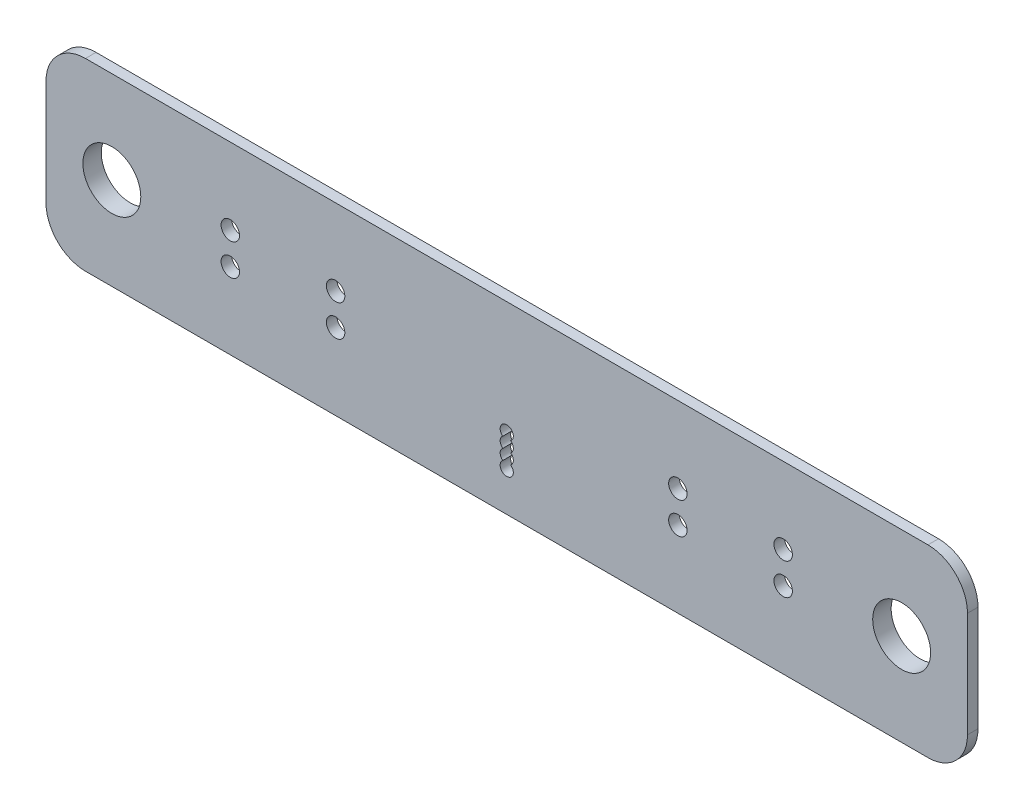
ISO-10303-21;
HEADER;
FILE_DESCRIPTION(('STEP AP214'),'2;1');
FILE_NAME('part.step','',(''),(''),'','','');
FILE_SCHEMA(('AUTOMOTIVE_DESIGN { 1 0 10303 214 1 1 1 1 }'));
ENDSEC;
DATA;
#1=APPLICATION_CONTEXT('core data for automotive mechanical design processes');
#2=APPLICATION_PROTOCOL_DEFINITION('international standard','automotive_design',2000,#1);
#3=PRODUCT_CONTEXT('',#1,'mechanical');
#4=PRODUCT('Part','Part','',(#3));
#5=PRODUCT_RELATED_PRODUCT_CATEGORY('part','',(#4));
#6=PRODUCT_DEFINITION_FORMATION('','',#4);
#7=PRODUCT_DEFINITION_CONTEXT('part definition',#1,'design');
#8=PRODUCT_DEFINITION('design','',#6,#7);
#9=PRODUCT_DEFINITION_SHAPE('','',#8);
#10=(LENGTH_UNIT() NAMED_UNIT(*) SI_UNIT(.MILLI.,.METRE.));
#11=(NAMED_UNIT(*) PLANE_ANGLE_UNIT() SI_UNIT($,.RADIAN.));
#12=(NAMED_UNIT(*) SI_UNIT($,.STERADIAN.) SOLID_ANGLE_UNIT());
#13=UNCERTAINTY_MEASURE_WITH_UNIT(LENGTH_MEASURE(1.E-05),#10,'distance_accuracy_value','');
#14=(GEOMETRIC_REPRESENTATION_CONTEXT(3) GLOBAL_UNCERTAINTY_ASSIGNED_CONTEXT((#13)) GLOBAL_UNIT_ASSIGNED_CONTEXT((#10,
#11,#12)) REPRESENTATION_CONTEXT('',''));
#15=CARTESIAN_POINT('',(0.,0.,0.));
#16=DIRECTION('',(0.,0.,1.));
#17=DIRECTION('',(1.,0.,0.));
#18=AXIS2_PLACEMENT_3D('',#15,#16,#17);
#19=CARTESIAN_POINT('',(0.,0.,0.));
#20=DIRECTION('',(0.,0.,1.));
#21=DIRECTION('',(1.,0.,0.));
#22=AXIS2_PLACEMENT_3D('',#19,#20,#21);
#23=PLANE('',#22);
#24=CARTESIAN_POINT('',(65.,6.,0.));
#25=DIRECTION('',(0.,0.,1.));
#26=DIRECTION('',(1.,0.,0.));
#27=AXIS2_PLACEMENT_3D('',#24,#25,#26);
#28=CIRCLE('',#27,3.50000000000001);
#29=CARTESIAN_POINT('',(68.5,6.,0.));
#30=VERTEX_POINT('',#29);
#31=EDGE_CURVE('E215',#30,#30,#28,.T.);
#32=ORIENTED_EDGE('',*,*,#31,.T.);
#33=EDGE_LOOP('',(#32));
#34=FACE_BOUND('',#33,.T.);
#35=CARTESIAN_POINT('',(65.,-6.,0.));
#36=DIRECTION('',(0.,0.,1.));
#37=DIRECTION('',(1.,0.,0.));
#38=AXIS2_PLACEMENT_3D('',#35,#36,#37);
#39=CIRCLE('',#38,3.50000000000001);
#40=CARTESIAN_POINT('',(68.5,-6.,0.));
#41=VERTEX_POINT('',#40);
#42=EDGE_CURVE('E212',#41,#41,#39,.T.);
#43=ORIENTED_EDGE('',*,*,#42,.T.);
#44=EDGE_LOOP('',(#43));
#45=FACE_BOUND('',#44,.T.);
#46=CARTESIAN_POINT('',(105.,-6.,0.));
#47=DIRECTION('',(0.,0.,1.));
#48=DIRECTION('',(1.,0.,0.));
#49=AXIS2_PLACEMENT_3D('',#46,#47,#48);
#50=CIRCLE('',#49,3.50000000000001);
#51=CARTESIAN_POINT('',(108.5,-6.,0.));
#52=VERTEX_POINT('',#51);
#53=EDGE_CURVE('E209',#52,#52,#50,.T.);
#54=ORIENTED_EDGE('',*,*,#53,.T.);
#55=EDGE_LOOP('',(#54));
#56=FACE_BOUND('',#55,.T.);
#57=CARTESIAN_POINT('',(105.,6.,0.));
#58=DIRECTION('',(0.,0.,1.));
#59=DIRECTION('',(1.,0.,0.));
#60=AXIS2_PLACEMENT_3D('',#57,#58,#59);
#61=CIRCLE('',#60,3.50000000000001);
#62=CARTESIAN_POINT('',(108.5,6.,0.));
#63=VERTEX_POINT('',#62);
#64=EDGE_CURVE('E206',#63,#63,#61,.T.);
#65=ORIENTED_EDGE('',*,*,#64,.T.);
#66=EDGE_LOOP('',(#65));
#67=FACE_BOUND('',#66,.T.);
#68=CARTESIAN_POINT('',(-65.,6.,0.));
#69=DIRECTION('',(0.,0.,1.));
#70=DIRECTION('',(1.,0.,0.));
#71=AXIS2_PLACEMENT_3D('',#68,#69,#70);
#72=CIRCLE('',#71,3.50000000000001);
#73=CARTESIAN_POINT('',(-61.5,6.,0.));
#74=VERTEX_POINT('',#73);
#75=EDGE_CURVE('E203',#74,#74,#72,.T.);
#76=ORIENTED_EDGE('',*,*,#75,.T.);
#77=EDGE_LOOP('',(#76));
#78=FACE_BOUND('',#77,.T.);
#79=CARTESIAN_POINT('',(-65.,-6.,0.));
#80=DIRECTION('',(0.,0.,1.));
#81=DIRECTION('',(1.,0.,0.));
#82=AXIS2_PLACEMENT_3D('',#79,#80,#81);
#83=CIRCLE('',#82,3.50000000000001);
#84=CARTESIAN_POINT('',(-61.5,-6.,0.));
#85=VERTEX_POINT('',#84);
#86=EDGE_CURVE('E200',#85,#85,#83,.T.);
#87=ORIENTED_EDGE('',*,*,#86,.T.);
#88=EDGE_LOOP('',(#87));
#89=FACE_BOUND('',#88,.T.);
#90=CARTESIAN_POINT('',(-105.,-6.,0.));
#91=DIRECTION('',(0.,0.,1.));
#92=DIRECTION('',(1.,0.,0.));
#93=AXIS2_PLACEMENT_3D('',#90,#91,#92);
#94=CIRCLE('',#93,3.50000000000001);
#95=CARTESIAN_POINT('',(-101.5,-6.,0.));
#96=VERTEX_POINT('',#95);
#97=EDGE_CURVE('E197',#96,#96,#94,.T.);
#98=ORIENTED_EDGE('',*,*,#97,.T.);
#99=EDGE_LOOP('',(#98));
#100=FACE_BOUND('',#99,.T.);
#101=CARTESIAN_POINT('',(0.,-12.,0.));
#102=DIRECTION('',(0.,0.,1.));
#103=DIRECTION('',(1.,0.,0.));
#104=AXIS2_PLACEMENT_3D('',#101,#102,#103);
#105=CIRCLE('',#104,2.5);
#106=CARTESIAN_POINT('',(-1.49999999999989,-9.99999999999998,0.));
#107=VERTEX_POINT('',#106);
#108=CARTESIAN_POINT('',(-1.49999999999994,-14.,0.));
#109=VERTEX_POINT('',#108);
#110=EDGE_CURVE('E191',#107,#109,#105,.T.);
#111=ORIENTED_EDGE('',*,*,#110,.T.);
#112=CARTESIAN_POINT('',(0.,-16.,0.));
#113=DIRECTION('',(0.,0.,1.));
#114=DIRECTION('',(1.,0.,0.));
#115=AXIS2_PLACEMENT_3D('',#112,#113,#114);
#116=CIRCLE('',#115,2.5);
#117=CARTESIAN_POINT('',(-1.49999999999998,-18.,0.));
#118=VERTEX_POINT('',#117);
#119=EDGE_CURVE('E194',#109,#118,#116,.T.);
#120=ORIENTED_EDGE('',*,*,#119,.T.);
#121=CARTESIAN_POINT('',(0.,-20.,0.));
#122=DIRECTION('',(0.,0.,1.));
#123=DIRECTION('',(1.,0.,0.));
#124=AXIS2_PLACEMENT_3D('',#121,#122,#123);
#125=CIRCLE('',#124,2.5);
#126=CARTESIAN_POINT('',(1.50000000000002,-18.,0.));
#127=VERTEX_POINT('',#126);
#128=EDGE_CURVE('E181',#118,#127,#125,.T.);
#129=ORIENTED_EDGE('',*,*,#128,.T.);
#130=CARTESIAN_POINT('',(0.,-16.,0.));
#131=DIRECTION('',(0.,0.,1.));
#132=DIRECTION('',(1.,0.,0.));
#133=AXIS2_PLACEMENT_3D('',#130,#131,#132);
#134=CIRCLE('',#133,2.5);
#135=CARTESIAN_POINT('',(1.50000000000006,-14.,0.));
#136=VERTEX_POINT('',#135);
#137=EDGE_CURVE('E143',#127,#136,#134,.T.);
#138=ORIENTED_EDGE('',*,*,#137,.T.);
#139=CARTESIAN_POINT('',(0.,-12.,0.));
#140=DIRECTION('',(0.,0.,1.));
#141=DIRECTION('',(1.,0.,0.));
#142=AXIS2_PLACEMENT_3D('',#139,#140,#141);
#143=CIRCLE('',#142,2.5);
#144=CARTESIAN_POINT('',(1.50000000000011,-10.,0.));
#145=VERTEX_POINT('',#144);
#146=EDGE_CURVE('E185',#136,#145,#143,.T.);
#147=ORIENTED_EDGE('',*,*,#146,.T.);
#148=CARTESIAN_POINT('',(1.26305651597926E-13,-8.,0.));
#149=DIRECTION('',(0.,0.,1.));
#150=DIRECTION('',(1.,0.,0.));
#151=AXIS2_PLACEMENT_3D('',#148,#149,#150);
#152=CIRCLE('',#151,2.5);
#153=EDGE_CURVE('E188',#145,#107,#152,.T.);
#154=ORIENTED_EDGE('',*,*,#153,.T.);
#155=EDGE_LOOP('',(#111,#120,#129,#138,#147,#154));
#156=FACE_BOUND('',#155,.T.);
#157=CARTESIAN_POINT('',(-105.,6.,0.));
#158=DIRECTION('',(0.,0.,1.));
#159=DIRECTION('',(1.,0.,0.));
#160=AXIS2_PLACEMENT_3D('',#157,#158,#159);
#161=CIRCLE('',#160,3.50000000000001);
#162=CARTESIAN_POINT('',(-101.5,6.,0.));
#163=VERTEX_POINT('',#162);
#164=EDGE_CURVE('E221',#163,#163,#161,.T.);
#165=ORIENTED_EDGE('',*,*,#164,.T.);
#166=EDGE_LOOP('',(#165));
#167=FACE_BOUND('',#166,.T.);
#168=CARTESIAN_POINT('',(-150.,0.,0.));
#169=DIRECTION('',(0.,0.,1.));
#170=DIRECTION('',(1.,0.,0.));
#171=AXIS2_PLACEMENT_3D('',#168,#169,#170);
#172=CIRCLE('',#171,13.5);
#173=CARTESIAN_POINT('',(-136.5,0.,0.));
#174=VERTEX_POINT('',#173);
#175=EDGE_CURVE('E227',#174,#174,#172,.T.);
#176=ORIENTED_EDGE('',*,*,#175,.T.);
#177=EDGE_LOOP('',(#176));
#178=FACE_BOUND('',#177,.T.);
#179=DIRECTION('',(0.,1.,0.));
#180=VECTOR('',#179,1.);
#181=CARTESIAN_POINT('',(175.,35.,0.));
#182=LINE('',#181,#180);
#183=CARTESIAN_POINT('',(175.,-20.,0.));
#184=VERTEX_POINT('',#183);
#185=CARTESIAN_POINT('',(175.,20.,0.));
#186=VERTEX_POINT('',#185);
#187=EDGE_CURVE('E242',#184,#186,#182,.T.);
#188=ORIENTED_EDGE('',*,*,#187,.F.);
#189=CARTESIAN_POINT('',(160.,-20.,0.));
#190=DIRECTION('',(0.,0.,1.));
#191=DIRECTION('',(1.,0.,0.));
#192=AXIS2_PLACEMENT_3D('',#189,#190,#191);
#193=CIRCLE('',#192,15.);
#194=CARTESIAN_POINT('',(160.,-35.,0.));
#195=VERTEX_POINT('',#194);
#196=EDGE_CURVE('E277',#184,#195,#193,.F.);
#197=ORIENTED_EDGE('',*,*,#196,.T.);
#198=DIRECTION('',(1.,0.,0.));
#199=VECTOR('',#198,1.);
#200=CARTESIAN_POINT('',(-175.,-35.,0.));
#201=LINE('',#200,#199);
#202=CARTESIAN_POINT('',(-160.,-35.,0.));
#203=VERTEX_POINT('',#202);
#204=EDGE_CURVE('E247',#203,#195,#201,.T.);
#205=ORIENTED_EDGE('',*,*,#204,.F.);
#206=CARTESIAN_POINT('',(-160.,-20.,0.));
#207=DIRECTION('',(0.,0.,1.));
#208=DIRECTION('',(1.,0.,0.));
#209=AXIS2_PLACEMENT_3D('',#206,#207,#208);
#210=CIRCLE('',#209,15.);
#211=CARTESIAN_POINT('',(-175.,-20.,0.));
#212=VERTEX_POINT('',#211);
#213=EDGE_CURVE('E273',#203,#212,#210,.F.);
#214=ORIENTED_EDGE('',*,*,#213,.T.);
#215=DIRECTION('',(0.,-1.,0.));
#216=VECTOR('',#215,1.);
#217=CARTESIAN_POINT('',(-175.,35.,0.));
#218=LINE('',#217,#216);
#219=CARTESIAN_POINT('',(-175.,20.,0.));
#220=VERTEX_POINT('',#219);
#221=EDGE_CURVE('E262',#220,#212,#218,.T.);
#222=ORIENTED_EDGE('',*,*,#221,.F.);
#223=CARTESIAN_POINT('',(-160.,20.,0.));
#224=DIRECTION('',(0.,0.,1.));
#225=DIRECTION('',(1.,0.,0.));
#226=AXIS2_PLACEMENT_3D('',#223,#224,#225);
#227=CIRCLE('',#226,15.);
#228=CARTESIAN_POINT('',(-160.,35.,0.));
#229=VERTEX_POINT('',#228);
#230=EDGE_CURVE('E271',#220,#229,#227,.F.);
#231=ORIENTED_EDGE('',*,*,#230,.T.);
#232=DIRECTION('',(-1.,0.,0.));
#233=VECTOR('',#232,1.);
#234=CARTESIAN_POINT('',(-175.,35.,0.));
#235=LINE('',#234,#233);
#236=CARTESIAN_POINT('',(160.,35.,0.));
#237=VERTEX_POINT('',#236);
#238=EDGE_CURVE('E259',#237,#229,#235,.T.);
#239=ORIENTED_EDGE('',*,*,#238,.F.);
#240=CARTESIAN_POINT('',(160.,20.,0.));
#241=DIRECTION('',(0.,0.,1.));
#242=DIRECTION('',(1.,0.,0.));
#243=AXIS2_PLACEMENT_3D('',#240,#241,#242);
#244=CIRCLE('',#243,15.);
#245=EDGE_CURVE('E275',#237,#186,#244,.F.);
#246=ORIENTED_EDGE('',*,*,#245,.T.);
#247=EDGE_LOOP('',(#188,#197,#205,#214,#222,#231,#239,#246));
#248=FACE_BOUND('',#247,.T.);
#249=CARTESIAN_POINT('',(150.,0.,0.));
#250=DIRECTION('',(0.,0.,1.));
#251=DIRECTION('',(1.,0.,0.));
#252=AXIS2_PLACEMENT_3D('',#249,#250,#251);
#253=CIRCLE('',#252,13.5);
#254=CARTESIAN_POINT('',(163.5,0.,0.));
#255=VERTEX_POINT('',#254);
#256=EDGE_CURVE('E11',#255,#255,#253,.F.);
#257=ORIENTED_EDGE('',*,*,#256,.F.);
#258=EDGE_LOOP('',(#257));
#259=FACE_BOUND('',#258,.T.);
#260=ADVANCED_FACE('F35',(#34,#45,#56,#67,#78,#89,#100,#156,#167,#178,#248,#259),#23,.F.);
#261=CARTESIAN_POINT('',(175.,35.,4.));
#262=DIRECTION('',(-1.,0.,0.));
#263=DIRECTION('',(0.,-1.,0.));
#264=AXIS2_PLACEMENT_3D('',#261,#262,#263);
#265=PLANE('',#264);
#266=DIRECTION('',(0.,1.,0.));
#267=VECTOR('',#266,1.);
#268=CARTESIAN_POINT('',(175.,35.,4.));
#269=LINE('',#268,#267);
#270=CARTESIAN_POINT('',(175.,-20.,4.));
#271=VERTEX_POINT('',#270);
#272=CARTESIAN_POINT('',(175.,20.,4.));
#273=VERTEX_POINT('',#272);
#274=EDGE_CURVE('E243',#271,#273,#269,.T.);
#275=ORIENTED_EDGE('',*,*,#274,.F.);
#276=DIRECTION('',(0.,0.,-1.));
#277=VECTOR('',#276,1.);
#278=CARTESIAN_POINT('',(175.,-20.,4.));
#279=LINE('',#278,#277);
#280=EDGE_CURVE('E268',#271,#184,#279,.T.);
#281=ORIENTED_EDGE('',*,*,#280,.T.);
#282=ORIENTED_EDGE('',*,*,#187,.T.);
#283=DIRECTION('',(0.,0.,-1.));
#284=VECTOR('',#283,1.);
#285=CARTESIAN_POINT('',(175.,20.,4.));
#286=LINE('',#285,#284);
#287=EDGE_CURVE('E256',#186,#273,#286,.F.);
#288=ORIENTED_EDGE('',*,*,#287,.T.);
#289=EDGE_LOOP('',(#275,#281,#282,#288));
#290=FACE_BOUND('',#289,.T.);
#291=ADVANCED_FACE('F326',(#290),#265,.F.);
#292=CARTESIAN_POINT('',(-175.,35.,4.));
#293=DIRECTION('',(0.,-1.,0.));
#294=DIRECTION('',(0.,0.,-1.));
#295=AXIS2_PLACEMENT_3D('',#292,#293,#294);
#296=PLANE('',#295);
#297=DIRECTION('',(-1.,0.,0.));
#298=VECTOR('',#297,1.);
#299=CARTESIAN_POINT('',(-175.,35.,4.));
#300=LINE('',#299,#298);
#301=CARTESIAN_POINT('',(160.,35.,4.));
#302=VERTEX_POINT('',#301);
#303=CARTESIAN_POINT('',(-160.,35.,4.));
#304=VERTEX_POINT('',#303);
#305=EDGE_CURVE('E246',#302,#304,#300,.T.);
#306=ORIENTED_EDGE('',*,*,#305,.F.);
#307=DIRECTION('',(0.,0.,-1.));
#308=VECTOR('',#307,1.);
#309=CARTESIAN_POINT('',(160.,35.,4.));
#310=LINE('',#309,#308);
#311=EDGE_CURVE('E294',#302,#237,#310,.T.);
#312=ORIENTED_EDGE('',*,*,#311,.T.);
#313=ORIENTED_EDGE('',*,*,#238,.T.);
#314=DIRECTION('',(0.,0.,-1.));
#315=VECTOR('',#314,1.);
#316=CARTESIAN_POINT('',(-160.,35.,4.));
#317=LINE('',#316,#315);
#318=EDGE_CURVE('E292',#229,#304,#317,.F.);
#319=ORIENTED_EDGE('',*,*,#318,.T.);
#320=EDGE_LOOP('',(#306,#312,#313,#319));
#321=FACE_BOUND('',#320,.T.);
#322=ADVANCED_FACE('F335',(#321),#296,.F.);
#323=CARTESIAN_POINT('',(-175.,35.,4.));
#324=DIRECTION('',(1.,0.,0.));
#325=DIRECTION('',(0.,0.,-1.));
#326=AXIS2_PLACEMENT_3D('',#323,#324,#325);
#327=PLANE('',#326);
#328=ORIENTED_EDGE('',*,*,#221,.T.);
#329=DIRECTION('',(0.,0.,-1.));
#330=VECTOR('',#329,1.);
#331=CARTESIAN_POINT('',(-175.,-20.,4.));
#332=LINE('',#331,#330);
#333=CARTESIAN_POINT('',(-175.,-20.,4.));
#334=VERTEX_POINT('',#333);
#335=EDGE_CURVE('E44',#212,#334,#332,.F.);
#336=ORIENTED_EDGE('',*,*,#335,.T.);
#337=DIRECTION('',(0.,-1.,0.));
#338=VECTOR('',#337,1.);
#339=CARTESIAN_POINT('',(-175.,35.,4.));
#340=LINE('',#339,#338);
#341=CARTESIAN_POINT('',(-175.,20.,4.));
#342=VERTEX_POINT('',#341);
#343=EDGE_CURVE('E250',#342,#334,#340,.T.);
#344=ORIENTED_EDGE('',*,*,#343,.F.);
#345=DIRECTION('',(0.,0.,-1.));
#346=VECTOR('',#345,1.);
#347=CARTESIAN_POINT('',(-175.,20.,4.));
#348=LINE('',#347,#346);
#349=EDGE_CURVE('E297',#342,#220,#348,.T.);
#350=ORIENTED_EDGE('',*,*,#349,.T.);
#351=EDGE_LOOP('',(#328,#336,#344,#350));
#352=FACE_BOUND('',#351,.T.);
#353=ADVANCED_FACE('F303',(#352),#327,.F.);
#354=CARTESIAN_POINT('',(-175.,-35.,4.));
#355=DIRECTION('',(0.,1.,0.));
#356=DIRECTION('',(0.,0.,1.));
#357=AXIS2_PLACEMENT_3D('',#354,#355,#356);
#358=PLANE('',#357);
#359=ORIENTED_EDGE('',*,*,#204,.T.);
#360=DIRECTION('',(0.,0.,-1.));
#361=VECTOR('',#360,1.);
#362=CARTESIAN_POINT('',(160.,-35.,4.));
#363=LINE('',#362,#361);
#364=CARTESIAN_POINT('',(160.,-35.,4.));
#365=VERTEX_POINT('',#364);
#366=EDGE_CURVE('E282',#195,#365,#363,.F.);
#367=ORIENTED_EDGE('',*,*,#366,.T.);
#368=DIRECTION('',(1.,0.,0.));
#369=VECTOR('',#368,1.);
#370=CARTESIAN_POINT('',(-175.,-35.,4.));
#371=LINE('',#370,#369);
#372=CARTESIAN_POINT('',(-160.,-35.,4.));
#373=VERTEX_POINT('',#372);
#374=EDGE_CURVE('E253',#373,#365,#371,.T.);
#375=ORIENTED_EDGE('',*,*,#374,.F.);
#376=DIRECTION('',(0.,0.,-1.));
#377=VECTOR('',#376,1.);
#378=CARTESIAN_POINT('',(-160.,-35.,4.));
#379=LINE('',#378,#377);
#380=EDGE_CURVE('E279',#373,#203,#379,.T.);
#381=ORIENTED_EDGE('',*,*,#380,.T.);
#382=EDGE_LOOP('',(#359,#367,#375,#381));
#383=FACE_BOUND('',#382,.T.);
#384=ADVANCED_FACE('F315',(#383),#358,.F.);
#385=CARTESIAN_POINT('',(0.,0.,4.));
#386=DIRECTION('',(0.,0.,1.));
#387=DIRECTION('',(1.,0.,0.));
#388=AXIS2_PLACEMENT_3D('',#385,#386,#387);
#389=PLANE('',#388);
#390=CARTESIAN_POINT('',(65.,6.,4.));
#391=DIRECTION('',(0.,0.,1.));
#392=DIRECTION('',(-1.,0.,0.));
#393=AXIS2_PLACEMENT_3D('',#390,#391,#392);
#394=CIRCLE('',#393,3.50000000000001);
#395=CARTESIAN_POINT('',(61.5,6.,4.));
#396=VERTEX_POINT('',#395);
#397=EDGE_CURVE('E183',#396,#396,#394,.T.);
#398=ORIENTED_EDGE('',*,*,#397,.F.);
#399=EDGE_LOOP('',(#398));
#400=FACE_BOUND('',#399,.T.);
#401=CARTESIAN_POINT('',(65.,-6.,4.));
#402=DIRECTION('',(0.,0.,1.));
#403=DIRECTION('',(-1.,0.,0.));
#404=AXIS2_PLACEMENT_3D('',#401,#402,#403);
#405=CIRCLE('',#404,3.50000000000001);
#406=CARTESIAN_POINT('',(61.5,-6.,4.));
#407=VERTEX_POINT('',#406);
#408=EDGE_CURVE('E592',#407,#407,#405,.T.);
#409=ORIENTED_EDGE('',*,*,#408,.F.);
#410=EDGE_LOOP('',(#409));
#411=FACE_BOUND('',#410,.T.);
#412=CARTESIAN_POINT('',(105.,-6.,4.));
#413=DIRECTION('',(0.,0.,1.));
#414=DIRECTION('',(-1.,0.,0.));
#415=AXIS2_PLACEMENT_3D('',#412,#413,#414);
#416=CIRCLE('',#415,3.50000000000001);
#417=CARTESIAN_POINT('',(101.5,-6.,4.));
#418=VERTEX_POINT('',#417);
#419=EDGE_CURVE('E595',#418,#418,#416,.T.);
#420=ORIENTED_EDGE('',*,*,#419,.F.);
#421=EDGE_LOOP('',(#420));
#422=FACE_BOUND('',#421,.T.);
#423=CARTESIAN_POINT('',(105.,6.,4.));
#424=DIRECTION('',(0.,0.,1.));
#425=DIRECTION('',(-1.,0.,0.));
#426=AXIS2_PLACEMENT_3D('',#423,#424,#425);
#427=CIRCLE('',#426,3.50000000000001);
#428=CARTESIAN_POINT('',(101.5,6.,4.));
#429=VERTEX_POINT('',#428);
#430=EDGE_CURVE('E170',#429,#429,#427,.T.);
#431=ORIENTED_EDGE('',*,*,#430,.F.);
#432=EDGE_LOOP('',(#431));
#433=FACE_BOUND('',#432,.T.);
#434=CARTESIAN_POINT('',(-65.,6.,4.));
#435=DIRECTION('',(0.,0.,1.));
#436=DIRECTION('',(1.,0.,0.));
#437=AXIS2_PLACEMENT_3D('',#434,#435,#436);
#438=CIRCLE('',#437,3.50000000000001);
#439=CARTESIAN_POINT('',(-61.5,6.,4.));
#440=VERTEX_POINT('',#439);
#441=EDGE_CURVE('E604',#440,#440,#438,.T.);
#442=ORIENTED_EDGE('',*,*,#441,.F.);
#443=EDGE_LOOP('',(#442));
#444=FACE_BOUND('',#443,.T.);
#445=CARTESIAN_POINT('',(-65.,-6.,4.));
#446=DIRECTION('',(0.,0.,1.));
#447=DIRECTION('',(1.,0.,0.));
#448=AXIS2_PLACEMENT_3D('',#445,#446,#447);
#449=CIRCLE('',#448,3.50000000000001);
#450=CARTESIAN_POINT('',(-61.5,-6.,4.));
#451=VERTEX_POINT('',#450);
#452=EDGE_CURVE('E180',#451,#451,#449,.T.);
#453=ORIENTED_EDGE('',*,*,#452,.F.);
#454=EDGE_LOOP('',(#453));
#455=FACE_BOUND('',#454,.T.);
#456=CARTESIAN_POINT('',(-105.,-6.,4.));
#457=DIRECTION('',(0.,0.,1.));
#458=DIRECTION('',(1.,0.,0.));
#459=AXIS2_PLACEMENT_3D('',#456,#457,#458);
#460=CIRCLE('',#459,3.50000000000001);
#461=CARTESIAN_POINT('',(-101.5,-6.,4.));
#462=VERTEX_POINT('',#461);
#463=EDGE_CURVE('E177',#462,#462,#460,.T.);
#464=ORIENTED_EDGE('',*,*,#463,.F.);
#465=EDGE_LOOP('',(#464));
#466=FACE_BOUND('',#465,.T.);
#467=CARTESIAN_POINT('',(0.,-16.,4.));
#468=DIRECTION('',(0.,0.,1.));
#469=DIRECTION('',(-1.,0.,0.));
#470=AXIS2_PLACEMENT_3D('',#467,#468,#469);
#471=CIRCLE('',#470,2.5);
#472=CARTESIAN_POINT('',(-1.49999999999994,-14.,4.));
#473=VERTEX_POINT('',#472);
#474=CARTESIAN_POINT('',(-1.49999999999998,-18.,4.));
#475=VERTEX_POINT('',#474);
#476=EDGE_CURVE('E59',#473,#475,#471,.T.);
#477=ORIENTED_EDGE('',*,*,#476,.F.);
#478=CARTESIAN_POINT('',(0.,-12.,4.));
#479=DIRECTION('',(0.,0.,1.));
#480=DIRECTION('',(-1.,0.,0.));
#481=AXIS2_PLACEMENT_3D('',#478,#479,#480);
#482=CIRCLE('',#481,2.5);
#483=CARTESIAN_POINT('',(-1.49999999999989,-9.99999999999998,4.));
#484=VERTEX_POINT('',#483);
#485=EDGE_CURVE('E165',#484,#473,#482,.T.);
#486=ORIENTED_EDGE('',*,*,#485,.F.);
#487=CARTESIAN_POINT('',(1.26305651597926E-13,-8.,4.));
#488=DIRECTION('',(0.,0.,1.));
#489=DIRECTION('',(-1.,0.,0.));
#490=AXIS2_PLACEMENT_3D('',#487,#488,#489);
#491=CIRCLE('',#490,2.5);
#492=CARTESIAN_POINT('',(1.50000000000011,-10.,4.));
#493=VERTEX_POINT('',#492);
#494=EDGE_CURVE('E159',#493,#484,#491,.T.);
#495=ORIENTED_EDGE('',*,*,#494,.F.);
#496=CARTESIAN_POINT('',(0.,-12.,4.));
#497=DIRECTION('',(0.,0.,1.));
#498=DIRECTION('',(-1.,0.,0.));
#499=AXIS2_PLACEMENT_3D('',#496,#497,#498);
#500=CIRCLE('',#499,2.5);
#501=CARTESIAN_POINT('',(1.50000000000006,-14.,4.));
#502=VERTEX_POINT('',#501);
#503=EDGE_CURVE('E157',#502,#493,#500,.T.);
#504=ORIENTED_EDGE('',*,*,#503,.F.);
#505=CARTESIAN_POINT('',(0.,-16.,4.));
#506=DIRECTION('',(0.,0.,1.));
#507=DIRECTION('',(-1.,0.,0.));
#508=AXIS2_PLACEMENT_3D('',#505,#506,#507);
#509=CIRCLE('',#508,2.5);
#510=CARTESIAN_POINT('',(1.50000000000002,-18.,4.));
#511=VERTEX_POINT('',#510);
#512=EDGE_CURVE('E140',#511,#502,#509,.T.);
#513=ORIENTED_EDGE('',*,*,#512,.F.);
#514=CARTESIAN_POINT('',(0.,-20.,4.));
#515=DIRECTION('',(0.,0.,1.));
#516=DIRECTION('',(-1.,0.,0.));
#517=AXIS2_PLACEMENT_3D('',#514,#515,#516);
#518=CIRCLE('',#517,2.5);
#519=EDGE_CURVE('E149',#475,#511,#518,.T.);
#520=ORIENTED_EDGE('',*,*,#519,.F.);
#521=EDGE_LOOP('',(#477,#486,#495,#504,#513,#520));
#522=FACE_BOUND('',#521,.T.);
#523=CARTESIAN_POINT('',(-105.,6.,4.));
#524=DIRECTION('',(0.,0.,1.));
#525=DIRECTION('',(1.,0.,0.));
#526=AXIS2_PLACEMENT_3D('',#523,#524,#525);
#527=CIRCLE('',#526,3.50000000000001);
#528=CARTESIAN_POINT('',(-101.5,6.,4.));
#529=VERTEX_POINT('',#528);
#530=EDGE_CURVE('E218',#529,#529,#527,.T.);
#531=ORIENTED_EDGE('',*,*,#530,.F.);
#532=EDGE_LOOP('',(#531));
#533=FACE_BOUND('',#532,.T.);
#534=CARTESIAN_POINT('',(-150.,0.,4.));
#535=DIRECTION('',(0.,0.,1.));
#536=DIRECTION('',(1.,0.,0.));
#537=AXIS2_PLACEMENT_3D('',#534,#535,#536);
#538=CIRCLE('',#537,11.);
#539=CARTESIAN_POINT('',(-139.,0.,4.));
#540=VERTEX_POINT('',#539);
#541=EDGE_CURVE('E39',#540,#540,#538,.F.);
#542=ORIENTED_EDGE('',*,*,#541,.T.);
#543=EDGE_LOOP('',(#542));
#544=FACE_BOUND('',#543,.T.);
#545=CARTESIAN_POINT('',(150.,0.,4.));
#546=DIRECTION('',(0.,0.,1.));
#547=DIRECTION('',(1.,0.,0.));
#548=AXIS2_PLACEMENT_3D('',#545,#546,#547);
#549=CIRCLE('',#548,11.);
#550=CARTESIAN_POINT('',(161.,0.,4.));
#551=VERTEX_POINT('',#550);
#552=EDGE_CURVE('E239',#551,#551,#549,.T.);
#553=ORIENTED_EDGE('',*,*,#552,.F.);
#554=EDGE_LOOP('',(#553));
#555=FACE_BOUND('',#554,.T.);
#556=ORIENTED_EDGE('',*,*,#374,.T.);
#557=CARTESIAN_POINT('',(160.,-20.,4.));
#558=DIRECTION('',(0.,0.,1.));
#559=DIRECTION('',(1.,0.,0.));
#560=AXIS2_PLACEMENT_3D('',#557,#558,#559);
#561=CIRCLE('',#560,15.);
#562=EDGE_CURVE('E290',#365,#271,#561,.T.);
#563=ORIENTED_EDGE('',*,*,#562,.T.);
#564=ORIENTED_EDGE('',*,*,#274,.T.);
#565=CARTESIAN_POINT('',(160.,20.,4.));
#566=DIRECTION('',(0.,0.,1.));
#567=DIRECTION('',(1.,0.,0.));
#568=AXIS2_PLACEMENT_3D('',#565,#566,#567);
#569=CIRCLE('',#568,15.);
#570=EDGE_CURVE('E288',#273,#302,#569,.T.);
#571=ORIENTED_EDGE('',*,*,#570,.T.);
#572=ORIENTED_EDGE('',*,*,#305,.T.);
#573=CARTESIAN_POINT('',(-160.,20.,4.));
#574=DIRECTION('',(0.,0.,1.));
#575=DIRECTION('',(1.,0.,0.));
#576=AXIS2_PLACEMENT_3D('',#573,#574,#575);
#577=CIRCLE('',#576,15.);
#578=EDGE_CURVE('E284',#304,#342,#577,.T.);
#579=ORIENTED_EDGE('',*,*,#578,.T.);
#580=ORIENTED_EDGE('',*,*,#343,.T.);
#581=CARTESIAN_POINT('',(-160.,-20.,4.));
#582=DIRECTION('',(0.,0.,1.));
#583=DIRECTION('',(1.,0.,0.));
#584=AXIS2_PLACEMENT_3D('',#581,#582,#583);
#585=CIRCLE('',#584,15.);
#586=EDGE_CURVE('E286',#334,#373,#585,.T.);
#587=ORIENTED_EDGE('',*,*,#586,.T.);
#588=EDGE_LOOP('',(#556,#563,#564,#571,#572,#579,#580,#587));
#589=FACE_BOUND('',#588,.T.);
#590=ADVANCED_FACE('F153',(#400,#411,#422,#433,#444,#455,#466,#522,#533,#544,#555,#589),#389,.T.);
#591=CARTESIAN_POINT('',(160.,-20.,4.));
#592=DIRECTION('',(0.,0.,-1.));
#593=DIRECTION('',(-1.,0.,0.));
#594=AXIS2_PLACEMENT_3D('',#591,#592,#593);
#595=CYLINDRICAL_SURFACE('',#594,15.);
#596=ORIENTED_EDGE('',*,*,#562,.F.);
#597=ORIENTED_EDGE('',*,*,#366,.F.);
#598=ORIENTED_EDGE('',*,*,#196,.F.);
#599=ORIENTED_EDGE('',*,*,#280,.F.);
#600=EDGE_LOOP('',(#596,#597,#598,#599));
#601=FACE_BOUND('',#600,.T.);
#602=ADVANCED_FACE('F323',(#601),#595,.T.);
#603=CARTESIAN_POINT('',(160.,20.,4.));
#604=DIRECTION('',(0.,0.,-1.));
#605=DIRECTION('',(-1.,0.,0.));
#606=AXIS2_PLACEMENT_3D('',#603,#604,#605);
#607=CYLINDRICAL_SURFACE('',#606,15.);
#608=ORIENTED_EDGE('',*,*,#570,.F.);
#609=ORIENTED_EDGE('',*,*,#287,.F.);
#610=ORIENTED_EDGE('',*,*,#245,.F.);
#611=ORIENTED_EDGE('',*,*,#311,.F.);
#612=EDGE_LOOP('',(#608,#609,#610,#611));
#613=FACE_BOUND('',#612,.T.);
#614=ADVANCED_FACE('F332',(#613),#607,.T.);
#615=CARTESIAN_POINT('',(-160.,-20.,4.));
#616=DIRECTION('',(0.,0.,-1.));
#617=DIRECTION('',(-1.,0.,0.));
#618=AXIS2_PLACEMENT_3D('',#615,#616,#617);
#619=CYLINDRICAL_SURFACE('',#618,15.);
#620=ORIENTED_EDGE('',*,*,#586,.F.);
#621=ORIENTED_EDGE('',*,*,#335,.F.);
#622=ORIENTED_EDGE('',*,*,#213,.F.);
#623=ORIENTED_EDGE('',*,*,#380,.F.);
#624=EDGE_LOOP('',(#620,#621,#622,#623));
#625=FACE_BOUND('',#624,.T.);
#626=ADVANCED_FACE('F312',(#625),#619,.T.);
#627=CARTESIAN_POINT('',(-160.,20.,4.));
#628=DIRECTION('',(0.,0.,-1.));
#629=DIRECTION('',(-1.,0.,0.));
#630=AXIS2_PLACEMENT_3D('',#627,#628,#629);
#631=CYLINDRICAL_SURFACE('',#630,15.);
#632=ORIENTED_EDGE('',*,*,#578,.F.);
#633=ORIENTED_EDGE('',*,*,#318,.F.);
#634=ORIENTED_EDGE('',*,*,#230,.F.);
#635=ORIENTED_EDGE('',*,*,#349,.F.);
#636=EDGE_LOOP('',(#632,#633,#634,#635));
#637=FACE_BOUND('',#636,.T.);
#638=ADVANCED_FACE('F37',(#637),#631,.T.);
#639=CARTESIAN_POINT('',(150.,0.,10.));
#640=DIRECTION('',(0.,0.,-1.));
#641=DIRECTION('',(-1.,0.,0.));
#642=AXIS2_PLACEMENT_3D('',#639,#640,#641);
#643=CYLINDRICAL_SURFACE('',#642,11.);
#644=ORIENTED_EDGE('',*,*,#552,.T.);
#645=EDGE_LOOP('',(#644));
#646=FACE_BOUND('',#645,.T.);
#647=CARTESIAN_POINT('',(150.,0.,-3.));
#648=DIRECTION('',(0.,0.,-1.));
#649=DIRECTION('',(-1.,0.,0.));
#650=AXIS2_PLACEMENT_3D('',#647,#648,#649);
#651=CIRCLE('',#650,11.);
#652=CARTESIAN_POINT('',(139.,0.,-3.));
#653=VERTEX_POINT('',#652);
#654=EDGE_CURVE('E233',#653,#653,#651,.T.);
#655=ORIENTED_EDGE('',*,*,#654,.T.);
#656=EDGE_LOOP('',(#655));
#657=FACE_BOUND('',#656,.T.);
#658=ADVANCED_FACE('F339',(#646,#657),#643,.F.);
#659=CARTESIAN_POINT('',(150.,0.,-3.));
#660=DIRECTION('',(0.,0.,-1.));
#661=DIRECTION('',(-1.,0.,0.));
#662=AXIS2_PLACEMENT_3D('',#659,#660,#661);
#663=PLANE('',#662);
#664=CARTESIAN_POINT('',(150.,0.,-3.));
#665=DIRECTION('',(0.,0.,-1.));
#666=DIRECTION('',(-1.,0.,0.));
#667=AXIS2_PLACEMENT_3D('',#664,#665,#666);
#668=CIRCLE('',#667,13.5);
#669=CARTESIAN_POINT('',(136.5,0.,-3.));
#670=VERTEX_POINT('',#669);
#671=EDGE_CURVE('E236',#670,#670,#668,.T.);
#672=ORIENTED_EDGE('',*,*,#671,.T.);
#673=EDGE_LOOP('',(#672));
#674=FACE_BOUND('',#673,.T.);
#675=ORIENTED_EDGE('',*,*,#654,.F.);
#676=EDGE_LOOP('',(#675));
#677=FACE_BOUND('',#676,.T.);
#678=ADVANCED_FACE('F344',(#674,#677),#663,.T.);
#679=CARTESIAN_POINT('',(150.,0.,-3.));
#680=DIRECTION('',(0.,0.,1.));
#681=DIRECTION('',(1.,0.,0.));
#682=AXIS2_PLACEMENT_3D('',#679,#680,#681);
#683=CYLINDRICAL_SURFACE('',#682,13.5);
#684=ORIENTED_EDGE('',*,*,#671,.F.);
#685=EDGE_LOOP('',(#684));
#686=FACE_BOUND('',#685,.T.);
#687=ORIENTED_EDGE('',*,*,#256,.T.);
#688=EDGE_LOOP('',(#687));
#689=FACE_BOUND('',#688,.T.);
#690=ADVANCED_FACE('F396',(#686,#689),#683,.T.);
#691=CARTESIAN_POINT('',(-150.,0.,10.));
#692=DIRECTION('',(0.,0.,-1.));
#693=DIRECTION('',(-1.,0.,0.));
#694=AXIS2_PLACEMENT_3D('',#691,#692,#693);
#695=CYLINDRICAL_SURFACE('',#694,11.);
#696=ORIENTED_EDGE('',*,*,#541,.F.);
#697=EDGE_LOOP('',(#696));
#698=FACE_BOUND('',#697,.T.);
#699=CARTESIAN_POINT('',(-150.,0.,-3.));
#700=DIRECTION('',(0.,0.,1.));
#701=DIRECTION('',(1.,0.,0.));
#702=AXIS2_PLACEMENT_3D('',#699,#700,#701);
#703=CIRCLE('',#702,11.);
#704=CARTESIAN_POINT('',(-139.,0.,-3.));
#705=VERTEX_POINT('',#704);
#706=EDGE_CURVE('E224',#705,#705,#703,.T.);
#707=ORIENTED_EDGE('',*,*,#706,.F.);
#708=EDGE_LOOP('',(#707));
#709=FACE_BOUND('',#708,.T.);
#710=ADVANCED_FACE('F406',(#698,#709),#695,.F.);
#711=CARTESIAN_POINT('',(-150.,0.,-3.));
#712=DIRECTION('',(0.,0.,1.));
#713=DIRECTION('',(1.,0.,0.));
#714=AXIS2_PLACEMENT_3D('',#711,#712,#713);
#715=CYLINDRICAL_SURFACE('',#714,13.5);
#716=CARTESIAN_POINT('',(-150.,0.,-3.));
#717=DIRECTION('',(0.,0.,1.));
#718=DIRECTION('',(1.,0.,0.));
#719=AXIS2_PLACEMENT_3D('',#716,#717,#718);
#720=CIRCLE('',#719,13.5);
#721=CARTESIAN_POINT('',(-136.5,0.,-3.));
#722=VERTEX_POINT('',#721);
#723=EDGE_CURVE('E228',#722,#722,#720,.T.);
#724=ORIENTED_EDGE('',*,*,#723,.T.);
#725=EDGE_LOOP('',(#724));
#726=FACE_BOUND('',#725,.T.);
#727=ORIENTED_EDGE('',*,*,#175,.F.);
#728=EDGE_LOOP('',(#727));
#729=FACE_BOUND('',#728,.T.);
#730=ADVANCED_FACE('F417',(#726,#729),#715,.T.);
#731=CARTESIAN_POINT('',(-150.,0.,-3.));
#732=DIRECTION('',(0.,0.,-1.));
#733=DIRECTION('',(1.,0.,0.));
#734=AXIS2_PLACEMENT_3D('',#731,#732,#733);
#735=PLANE('',#734);
#736=ORIENTED_EDGE('',*,*,#706,.T.);
#737=EDGE_LOOP('',(#736));
#738=FACE_BOUND('',#737,.T.);
#739=ORIENTED_EDGE('',*,*,#723,.F.);
#740=EDGE_LOOP('',(#739));
#741=FACE_BOUND('',#740,.T.);
#742=ADVANCED_FACE('F427',(#738,#741),#735,.T.);
#743=CARTESIAN_POINT('',(-105.,6.,-6.));
#744=DIRECTION('',(0.,0.,1.));
#745=DIRECTION('',(1.,0.,0.));
#746=AXIS2_PLACEMENT_3D('',#743,#744,#745);
#747=CYLINDRICAL_SURFACE('',#746,3.50000000000001);
#748=ORIENTED_EDGE('',*,*,#530,.T.);
#749=EDGE_LOOP('',(#748));
#750=FACE_BOUND('',#749,.T.);
#751=ORIENTED_EDGE('',*,*,#164,.F.);
#752=EDGE_LOOP('',(#751));
#753=FACE_BOUND('',#752,.T.);
#754=ADVANCED_FACE('F436',(#750,#753),#747,.F.);
#755=CARTESIAN_POINT('',(0.,-16.,-6.));
#756=DIRECTION('',(0.,0.,1.));
#757=DIRECTION('',(1.,0.,0.));
#758=AXIS2_PLACEMENT_3D('',#755,#756,#757);
#759=CYLINDRICAL_SURFACE('',#758,2.5);
#760=DIRECTION('',(0.,0.,1.));
#761=VECTOR('',#760,1.);
#762=CARTESIAN_POINT('',(-1.49999999999994,-14.,-6.));
#763=LINE('',#762,#761);
#764=EDGE_CURVE('E168',#109,#473,#763,.T.);
#765=ORIENTED_EDGE('',*,*,#764,.T.);
#766=ORIENTED_EDGE('',*,*,#476,.T.);
#767=DIRECTION('',(0.,0.,1.));
#768=VECTOR('',#767,1.);
#769=CARTESIAN_POINT('',(-1.49999999999998,-18.,-6.));
#770=LINE('',#769,#768);
#771=EDGE_CURVE('E146',#118,#475,#770,.T.);
#772=ORIENTED_EDGE('',*,*,#771,.F.);
#773=ORIENTED_EDGE('',*,*,#119,.F.);
#774=EDGE_LOOP('',(#765,#766,#772,#773));
#775=FACE_BOUND('',#774,.T.);
#776=ADVANCED_FACE('F459',(#775),#759,.F.);
#777=CARTESIAN_POINT('',(0.,-12.,-6.));
#778=DIRECTION('',(0.,0.,1.));
#779=DIRECTION('',(1.,0.,0.));
#780=AXIS2_PLACEMENT_3D('',#777,#778,#779);
#781=CYLINDRICAL_SURFACE('',#780,2.5);
#782=DIRECTION('',(0.,0.,1.));
#783=VECTOR('',#782,1.);
#784=CARTESIAN_POINT('',(-1.49999999999989,-9.99999999999998,-6.));
#785=LINE('',#784,#783);
#786=EDGE_CURVE('E171',#107,#484,#785,.T.);
#787=ORIENTED_EDGE('',*,*,#786,.T.);
#788=ORIENTED_EDGE('',*,*,#485,.T.);
#789=ORIENTED_EDGE('',*,*,#764,.F.);
#790=ORIENTED_EDGE('',*,*,#110,.F.);
#791=EDGE_LOOP('',(#787,#788,#789,#790));
#792=FACE_BOUND('',#791,.T.);
#793=ADVANCED_FACE('F469',(#792),#781,.F.);
#794=CARTESIAN_POINT('',(1.26305651597926E-13,-8.,-6.));
#795=DIRECTION('',(0.,0.,1.));
#796=DIRECTION('',(1.,0.,0.));
#797=AXIS2_PLACEMENT_3D('',#794,#795,#796);
#798=CYLINDRICAL_SURFACE('',#797,2.5);
#799=DIRECTION('',(0.,0.,1.));
#800=VECTOR('',#799,1.);
#801=CARTESIAN_POINT('',(1.50000000000011,-10.,-6.));
#802=LINE('',#801,#800);
#803=EDGE_CURVE('E173',#145,#493,#802,.T.);
#804=ORIENTED_EDGE('',*,*,#803,.T.);
#805=ORIENTED_EDGE('',*,*,#494,.T.);
#806=ORIENTED_EDGE('',*,*,#786,.F.);
#807=ORIENTED_EDGE('',*,*,#153,.F.);
#808=EDGE_LOOP('',(#804,#805,#806,#807));
#809=FACE_BOUND('',#808,.T.);
#810=ADVANCED_FACE('F478',(#809),#798,.F.);
#811=CARTESIAN_POINT('',(0.,-12.,-6.));
#812=DIRECTION('',(0.,0.,1.));
#813=DIRECTION('',(1.,0.,0.));
#814=AXIS2_PLACEMENT_3D('',#811,#812,#813);
#815=CYLINDRICAL_SURFACE('',#814,2.5);
#816=DIRECTION('',(0.,0.,1.));
#817=VECTOR('',#816,1.);
#818=CARTESIAN_POINT('',(1.50000000000006,-14.,-6.));
#819=LINE('',#818,#817);
#820=EDGE_CURVE('E145',#136,#502,#819,.T.);
#821=ORIENTED_EDGE('',*,*,#820,.T.);
#822=ORIENTED_EDGE('',*,*,#503,.T.);
#823=ORIENTED_EDGE('',*,*,#803,.F.);
#824=ORIENTED_EDGE('',*,*,#146,.F.);
#825=EDGE_LOOP('',(#821,#822,#823,#824));
#826=FACE_BOUND('',#825,.T.);
#827=ADVANCED_FACE('F488',(#826),#815,.F.);
#828=CARTESIAN_POINT('',(0.,-16.,-6.));
#829=DIRECTION('',(0.,0.,1.));
#830=DIRECTION('',(1.,0.,0.));
#831=AXIS2_PLACEMENT_3D('',#828,#829,#830);
#832=CYLINDRICAL_SURFACE('',#831,2.5);
#833=DIRECTION('',(0.,0.,1.));
#834=VECTOR('',#833,1.);
#835=CARTESIAN_POINT('',(1.50000000000002,-18.,-6.));
#836=LINE('',#835,#834);
#837=EDGE_CURVE('E51',#127,#511,#836,.T.);
#838=ORIENTED_EDGE('',*,*,#837,.T.);
#839=ORIENTED_EDGE('',*,*,#512,.T.);
#840=ORIENTED_EDGE('',*,*,#820,.F.);
#841=ORIENTED_EDGE('',*,*,#137,.F.);
#842=EDGE_LOOP('',(#838,#839,#840,#841));
#843=FACE_BOUND('',#842,.T.);
#844=ADVANCED_FACE('F137',(#843),#832,.F.);
#845=CARTESIAN_POINT('',(0.,-20.,-6.));
#846=DIRECTION('',(0.,0.,1.));
#847=DIRECTION('',(1.,0.,0.));
#848=AXIS2_PLACEMENT_3D('',#845,#846,#847);
#849=CYLINDRICAL_SURFACE('',#848,2.5);
#850=ORIENTED_EDGE('',*,*,#771,.T.);
#851=ORIENTED_EDGE('',*,*,#519,.T.);
#852=ORIENTED_EDGE('',*,*,#837,.F.);
#853=ORIENTED_EDGE('',*,*,#128,.F.);
#854=EDGE_LOOP('',(#850,#851,#852,#853));
#855=FACE_BOUND('',#854,.T.);
#856=ADVANCED_FACE('F150',(#855),#849,.F.);
#857=CARTESIAN_POINT('',(-105.,-6.,-6.));
#858=DIRECTION('',(0.,0.,1.));
#859=DIRECTION('',(1.,0.,0.));
#860=AXIS2_PLACEMENT_3D('',#857,#858,#859);
#861=CYLINDRICAL_SURFACE('',#860,3.50000000000001);
#862=ORIENTED_EDGE('',*,*,#463,.T.);
#863=EDGE_LOOP('',(#862));
#864=FACE_BOUND('',#863,.T.);
#865=ORIENTED_EDGE('',*,*,#97,.F.);
#866=EDGE_LOOP('',(#865));
#867=FACE_BOUND('',#866,.T.);
#868=ADVANCED_FACE('F515',(#864,#867),#861,.F.);
#869=CARTESIAN_POINT('',(-65.,-6.,-6.));
#870=DIRECTION('',(0.,0.,1.));
#871=DIRECTION('',(1.,0.,0.));
#872=AXIS2_PLACEMENT_3D('',#869,#870,#871);
#873=CYLINDRICAL_SURFACE('',#872,3.50000000000001);
#874=ORIENTED_EDGE('',*,*,#452,.T.);
#875=EDGE_LOOP('',(#874));
#876=FACE_BOUND('',#875,.T.);
#877=ORIENTED_EDGE('',*,*,#86,.F.);
#878=EDGE_LOOP('',(#877));
#879=FACE_BOUND('',#878,.T.);
#880=ADVANCED_FACE('F524',(#876,#879),#873,.F.);
#881=CARTESIAN_POINT('',(-65.,6.,-6.));
#882=DIRECTION('',(0.,0.,1.));
#883=DIRECTION('',(1.,0.,0.));
#884=AXIS2_PLACEMENT_3D('',#881,#882,#883);
#885=CYLINDRICAL_SURFACE('',#884,3.50000000000001);
#886=ORIENTED_EDGE('',*,*,#441,.T.);
#887=EDGE_LOOP('',(#886));
#888=FACE_BOUND('',#887,.T.);
#889=ORIENTED_EDGE('',*,*,#75,.F.);
#890=EDGE_LOOP('',(#889));
#891=FACE_BOUND('',#890,.T.);
#892=ADVANCED_FACE('F534',(#888,#891),#885,.F.);
#893=CARTESIAN_POINT('',(105.,6.,-6.));
#894=DIRECTION('',(0.,0.,1.));
#895=DIRECTION('',(1.,0.,0.));
#896=AXIS2_PLACEMENT_3D('',#893,#894,#895);
#897=CYLINDRICAL_SURFACE('',#896,3.50000000000001);
#898=ORIENTED_EDGE('',*,*,#430,.T.);
#899=EDGE_LOOP('',(#898));
#900=FACE_BOUND('',#899,.T.);
#901=ORIENTED_EDGE('',*,*,#64,.F.);
#902=EDGE_LOOP('',(#901));
#903=FACE_BOUND('',#902,.T.);
#904=ADVANCED_FACE('F544',(#900,#903),#897,.F.);
#905=CARTESIAN_POINT('',(105.,-6.,-6.));
#906=DIRECTION('',(0.,0.,1.));
#907=DIRECTION('',(1.,0.,0.));
#908=AXIS2_PLACEMENT_3D('',#905,#906,#907);
#909=CYLINDRICAL_SURFACE('',#908,3.50000000000001);
#910=ORIENTED_EDGE('',*,*,#419,.T.);
#911=EDGE_LOOP('',(#910));
#912=FACE_BOUND('',#911,.T.);
#913=ORIENTED_EDGE('',*,*,#53,.F.);
#914=EDGE_LOOP('',(#913));
#915=FACE_BOUND('',#914,.T.);
#916=ADVANCED_FACE('F554',(#912,#915),#909,.F.);
#917=CARTESIAN_POINT('',(65.,-6.,-6.));
#918=DIRECTION('',(0.,0.,1.));
#919=DIRECTION('',(1.,0.,0.));
#920=AXIS2_PLACEMENT_3D('',#917,#918,#919);
#921=CYLINDRICAL_SURFACE('',#920,3.50000000000001);
#922=ORIENTED_EDGE('',*,*,#408,.T.);
#923=EDGE_LOOP('',(#922));
#924=FACE_BOUND('',#923,.T.);
#925=ORIENTED_EDGE('',*,*,#42,.F.);
#926=EDGE_LOOP('',(#925));
#927=FACE_BOUND('',#926,.T.);
#928=ADVANCED_FACE('F564',(#924,#927),#921,.F.);
#929=CARTESIAN_POINT('',(65.,6.,-6.));
#930=DIRECTION('',(0.,0.,1.));
#931=DIRECTION('',(1.,0.,0.));
#932=AXIS2_PLACEMENT_3D('',#929,#930,#931);
#933=CYLINDRICAL_SURFACE('',#932,3.50000000000001);
#934=ORIENTED_EDGE('',*,*,#397,.T.);
#935=EDGE_LOOP('',(#934));
#936=FACE_BOUND('',#935,.T.);
#937=ORIENTED_EDGE('',*,*,#31,.F.);
#938=EDGE_LOOP('',(#937));
#939=FACE_BOUND('',#938,.T.);
#940=ADVANCED_FACE('F574',(#936,#939),#933,.F.);
#941=CLOSED_SHELL('',(#260,#291,#322,#353,#384,#590,#602,#614,#626,#638,#658,#678,#690,#710,
#730,#742,#754,#776,#793,#810,#827,#844,#856,#868,#880,#892,#904,#916,#928,#940));
#942=MANIFOLD_SOLID_BREP('B2',#941);
#943=ADVANCED_BREP_SHAPE_REPRESENTATION('',(#18,#942),#14);
#944=SHAPE_DEFINITION_REPRESENTATION(#9,#943);
ENDSEC;
END-ISO-10303-21;
